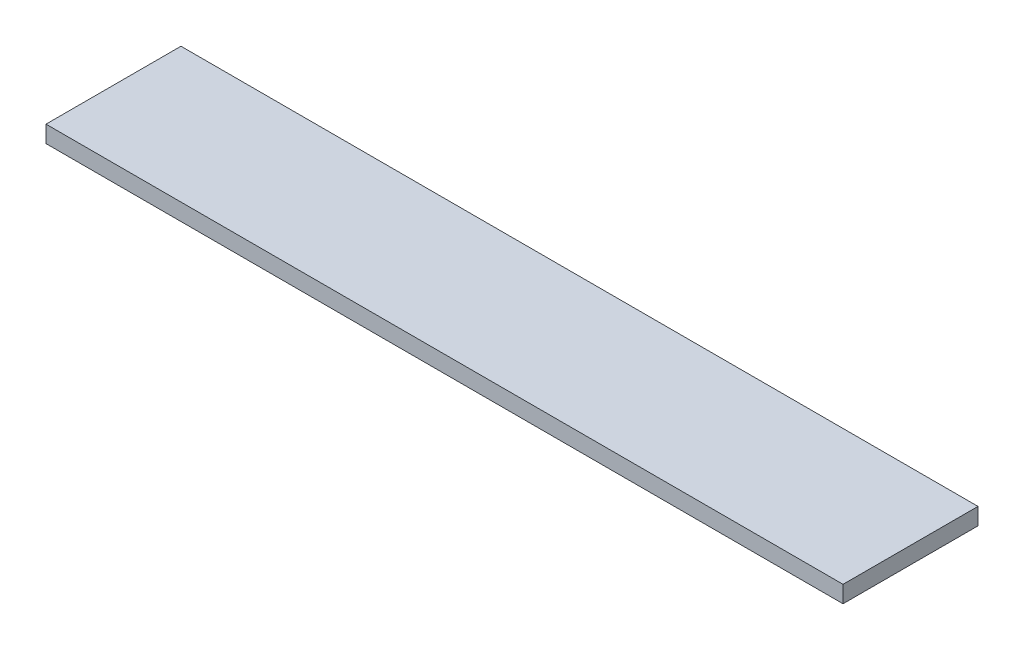
ISO-10303-21;
HEADER;
FILE_DESCRIPTION(('STEP AP214'),'2;1');
FILE_NAME('part.step','',(''),(''),'','','');
FILE_SCHEMA(('AUTOMOTIVE_DESIGN { 1 0 10303 214 1 1 1 1 }'));
ENDSEC;
DATA;
#1=APPLICATION_CONTEXT('core data for automotive mechanical design processes');
#2=APPLICATION_PROTOCOL_DEFINITION('international standard','automotive_design',2000,#1);
#3=PRODUCT_CONTEXT('',#1,'mechanical');
#4=PRODUCT('Part','Part','',(#3));
#5=PRODUCT_RELATED_PRODUCT_CATEGORY('part','',(#4));
#6=PRODUCT_DEFINITION_FORMATION('','',#4);
#7=PRODUCT_DEFINITION_CONTEXT('part definition',#1,'design');
#8=PRODUCT_DEFINITION('design','',#6,#7);
#9=PRODUCT_DEFINITION_SHAPE('','',#8);
#10=(LENGTH_UNIT() NAMED_UNIT(*) SI_UNIT(.MILLI.,.METRE.));
#11=(NAMED_UNIT(*) PLANE_ANGLE_UNIT() SI_UNIT($,.RADIAN.));
#12=(NAMED_UNIT(*) SI_UNIT($,.STERADIAN.) SOLID_ANGLE_UNIT());
#13=UNCERTAINTY_MEASURE_WITH_UNIT(LENGTH_MEASURE(1.E-05),#10,'distance_accuracy_value','');
#14=(GEOMETRIC_REPRESENTATION_CONTEXT(3) GLOBAL_UNCERTAINTY_ASSIGNED_CONTEXT((#13)) GLOBAL_UNIT_ASSIGNED_CONTEXT((#10,
#11,#12)) REPRESENTATION_CONTEXT('',''));
#15=CARTESIAN_POINT('',(0.,0.,0.));
#16=DIRECTION('',(0.,0.,1.));
#17=DIRECTION('',(1.,0.,0.));
#18=AXIS2_PLACEMENT_3D('',#15,#16,#17);
#19=CARTESIAN_POINT('',(600.,0.,0.));
#20=DIRECTION('',(0.,0.,-1.));
#21=DIRECTION('',(-1.,0.,0.));
#22=AXIS2_PLACEMENT_3D('',#19,#20,#21);
#23=PLANE('',#22);
#24=DIRECTION('',(0.,-1.,0.));
#25=VECTOR('',#24,1.);
#26=CARTESIAN_POINT('',(0.,0.,0.));
#27=LINE('',#26,#25);
#28=CARTESIAN_POINT('',(0.,12.7,0.));
#29=VERTEX_POINT('',#28);
#30=CARTESIAN_POINT('',(0.,0.,0.));
#31=VERTEX_POINT('',#30);
#32=EDGE_CURVE('E95',#29,#31,#27,.T.);
#33=ORIENTED_EDGE('',*,*,#32,.T.);
#34=DIRECTION('',(-1.,0.,0.));
#35=VECTOR('',#34,1.);
#36=CARTESIAN_POINT('',(600.,0.,0.));
#37=LINE('',#36,#35);
#38=CARTESIAN_POINT('',(600.,0.,0.));
#39=VERTEX_POINT('',#38);
#40=EDGE_CURVE('E11',#39,#31,#37,.T.);
#41=ORIENTED_EDGE('',*,*,#40,.F.);
#42=DIRECTION('',(0.,-1.,0.));
#43=VECTOR('',#42,1.);
#44=CARTESIAN_POINT('',(600.,0.,0.));
#45=LINE('',#44,#43);
#46=CARTESIAN_POINT('',(600.,12.7,0.));
#47=VERTEX_POINT('',#46);
#48=EDGE_CURVE('E83',#47,#39,#45,.T.);
#49=ORIENTED_EDGE('',*,*,#48,.F.);
#50=DIRECTION('',(-1.,0.,0.));
#51=VECTOR('',#50,1.);
#52=CARTESIAN_POINT('',(600.,12.7,0.));
#53=LINE('',#52,#51);
#54=EDGE_CURVE('E91',#47,#29,#53,.T.);
#55=ORIENTED_EDGE('',*,*,#54,.T.);
#56=EDGE_LOOP('',(#33,#41,#49,#55));
#57=FACE_BOUND('',#56,.T.);
#58=ADVANCED_FACE('F32',(#57),#23,.F.);
#59=CARTESIAN_POINT('',(600.,0.,0.));
#60=DIRECTION('',(0.,1.,0.));
#61=DIRECTION('',(0.,0.,1.));
#62=AXIS2_PLACEMENT_3D('',#59,#60,#61);
#63=PLANE('',#62);
#64=DIRECTION('',(0.,0.,-1.));
#65=VECTOR('',#64,1.);
#66=CARTESIAN_POINT('',(0.,0.,0.));
#67=LINE('',#66,#65);
#68=CARTESIAN_POINT('',(0.,0.,-101.6));
#69=VERTEX_POINT('',#68);
#70=EDGE_CURVE('E87',#31,#69,#67,.T.);
#71=ORIENTED_EDGE('',*,*,#70,.T.);
#72=DIRECTION('',(-1.,0.,0.));
#73=VECTOR('',#72,1.);
#74=CARTESIAN_POINT('',(600.,0.,-101.6));
#75=LINE('',#74,#73);
#76=CARTESIAN_POINT('',(600.,0.,-101.6));
#77=VERTEX_POINT('',#76);
#78=EDGE_CURVE('E40',#77,#69,#75,.T.);
#79=ORIENTED_EDGE('',*,*,#78,.F.);
#80=DIRECTION('',(0.,0.,-1.));
#81=VECTOR('',#80,1.);
#82=CARTESIAN_POINT('',(600.,0.,0.));
#83=LINE('',#82,#81);
#84=EDGE_CURVE('E78',#39,#77,#83,.T.);
#85=ORIENTED_EDGE('',*,*,#84,.F.);
#86=ORIENTED_EDGE('',*,*,#40,.T.);
#87=EDGE_LOOP('',(#71,#79,#85,#86));
#88=FACE_BOUND('',#87,.T.);
#89=ADVANCED_FACE('F86',(#88),#63,.F.);
#90=CARTESIAN_POINT('',(600.,0.,-101.6));
#91=DIRECTION('',(0.,0.,1.));
#92=DIRECTION('',(1.,0.,0.));
#93=AXIS2_PLACEMENT_3D('',#90,#91,#92);
#94=PLANE('',#93);
#95=DIRECTION('',(0.,1.,0.));
#96=VECTOR('',#95,1.);
#97=CARTESIAN_POINT('',(0.,0.,-101.6));
#98=LINE('',#97,#96);
#99=CARTESIAN_POINT('',(0.,12.7,-101.6));
#100=VERTEX_POINT('',#99);
#101=EDGE_CURVE('E65',#69,#100,#98,.T.);
#102=ORIENTED_EDGE('',*,*,#101,.T.);
#103=DIRECTION('',(-1.,0.,0.));
#104=VECTOR('',#103,1.);
#105=CARTESIAN_POINT('',(600.,12.7,-101.6));
#106=LINE('',#105,#104);
#107=CARTESIAN_POINT('',(600.,12.7,-101.6));
#108=VERTEX_POINT('',#107);
#109=EDGE_CURVE('E88',#108,#100,#106,.T.);
#110=ORIENTED_EDGE('',*,*,#109,.F.);
#111=DIRECTION('',(0.,1.,0.));
#112=VECTOR('',#111,1.);
#113=CARTESIAN_POINT('',(600.,0.,-101.6));
#114=LINE('',#113,#112);
#115=EDGE_CURVE('E81',#77,#108,#114,.T.);
#116=ORIENTED_EDGE('',*,*,#115,.F.);
#117=ORIENTED_EDGE('',*,*,#78,.T.);
#118=EDGE_LOOP('',(#102,#110,#116,#117));
#119=FACE_BOUND('',#118,.T.);
#120=ADVANCED_FACE('F89',(#119),#94,.F.);
#121=CARTESIAN_POINT('',(600.,12.7,0.));
#122=DIRECTION('',(0.,-1.,0.));
#123=DIRECTION('',(0.,0.,-1.));
#124=AXIS2_PLACEMENT_3D('',#121,#122,#123);
#125=PLANE('',#124);
#126=DIRECTION('',(0.,0.,1.));
#127=VECTOR('',#126,1.);
#128=CARTESIAN_POINT('',(0.,12.7,0.));
#129=LINE('',#128,#127);
#130=EDGE_CURVE('E71',#100,#29,#129,.T.);
#131=ORIENTED_EDGE('',*,*,#130,.T.);
#132=ORIENTED_EDGE('',*,*,#54,.F.);
#133=DIRECTION('',(0.,0.,1.));
#134=VECTOR('',#133,1.);
#135=CARTESIAN_POINT('',(600.,12.7,0.));
#136=LINE('',#135,#134);
#137=EDGE_CURVE('E48',#108,#47,#136,.T.);
#138=ORIENTED_EDGE('',*,*,#137,.F.);
#139=ORIENTED_EDGE('',*,*,#109,.T.);
#140=EDGE_LOOP('',(#131,#132,#138,#139));
#141=FACE_BOUND('',#140,.T.);
#142=ADVANCED_FACE('F102',(#141),#125,.F.);
#143=CARTESIAN_POINT('',(600.,0.,0.));
#144=DIRECTION('',(-1.,0.,0.));
#145=DIRECTION('',(0.,0.,1.));
#146=AXIS2_PLACEMENT_3D('',#143,#144,#145);
#147=PLANE('',#146);
#148=ORIENTED_EDGE('',*,*,#48,.T.);
#149=ORIENTED_EDGE('',*,*,#84,.T.);
#150=ORIENTED_EDGE('',*,*,#115,.T.);
#151=ORIENTED_EDGE('',*,*,#137,.T.);
#152=EDGE_LOOP('',(#148,#149,#150,#151));
#153=FACE_BOUND('',#152,.T.);
#154=ADVANCED_FACE('F79',(#153),#147,.F.);
#155=CARTESIAN_POINT('',(0.,0.,0.));
#156=DIRECTION('',(-1.,0.,0.));
#157=DIRECTION('',(0.,0.,1.));
#158=AXIS2_PLACEMENT_3D('',#155,#156,#157);
#159=PLANE('',#158);
#160=ORIENTED_EDGE('',*,*,#32,.F.);
#161=ORIENTED_EDGE('',*,*,#130,.F.);
#162=ORIENTED_EDGE('',*,*,#101,.F.);
#163=ORIENTED_EDGE('',*,*,#70,.F.);
#164=EDGE_LOOP('',(#160,#161,#162,#163));
#165=FACE_BOUND('',#164,.T.);
#166=ADVANCED_FACE('F105',(#165),#159,.T.);
#167=CLOSED_SHELL('',(#58,#89,#120,#142,#154,#166));
#168=MANIFOLD_SOLID_BREP('B2',#167);
#169=ADVANCED_BREP_SHAPE_REPRESENTATION('',(#18,#168),#14);
#170=SHAPE_DEFINITION_REPRESENTATION(#9,#169);
ENDSEC;
END-ISO-10303-21;
